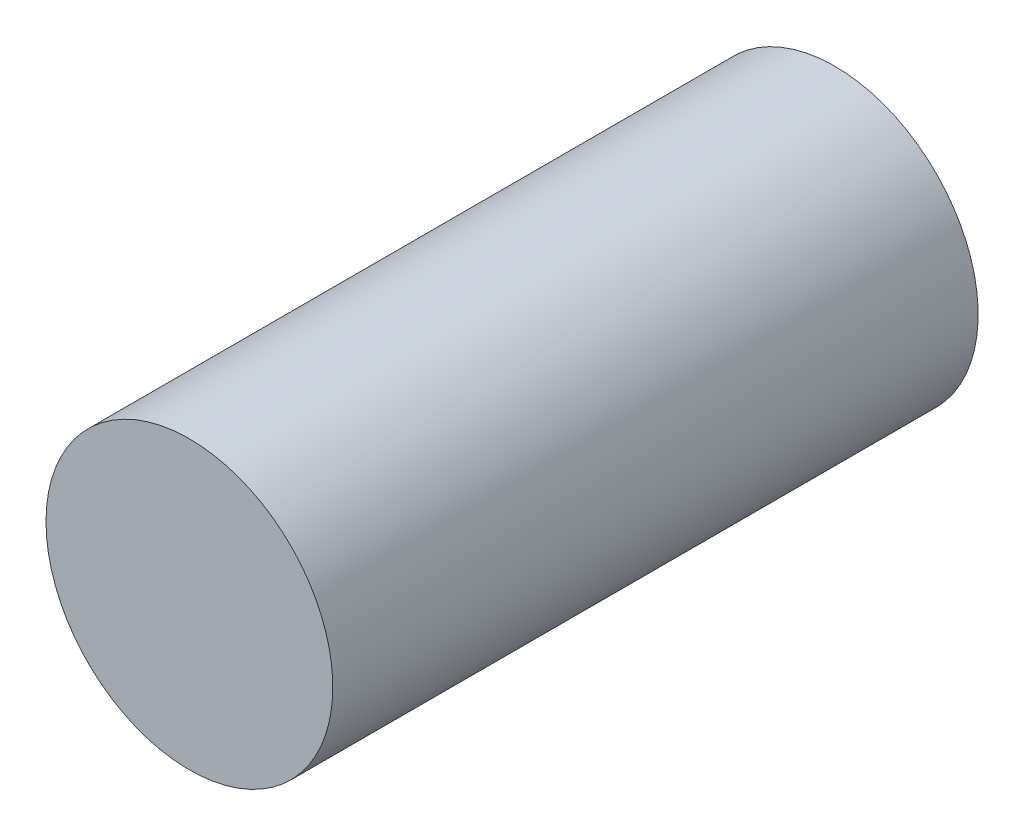
ISO-10303-21;
HEADER;
FILE_DESCRIPTION(('STEP AP214'),'2;1');
FILE_NAME('part.step','',(''),(''),'','','');
FILE_SCHEMA(('AUTOMOTIVE_DESIGN { 1 0 10303 214 1 1 1 1 }'));
ENDSEC;
DATA;
#1=APPLICATION_CONTEXT('core data for automotive mechanical design processes');
#2=APPLICATION_PROTOCOL_DEFINITION('international standard','automotive_design',2000,#1);
#3=PRODUCT_CONTEXT('',#1,'mechanical');
#4=PRODUCT('Part','Part','',(#3));
#5=PRODUCT_RELATED_PRODUCT_CATEGORY('part','',(#4));
#6=PRODUCT_DEFINITION_FORMATION('','',#4);
#7=PRODUCT_DEFINITION_CONTEXT('part definition',#1,'design');
#8=PRODUCT_DEFINITION('design','',#6,#7);
#9=PRODUCT_DEFINITION_SHAPE('','',#8);
#10=(LENGTH_UNIT() NAMED_UNIT(*) SI_UNIT(.MILLI.,.METRE.));
#11=(NAMED_UNIT(*) PLANE_ANGLE_UNIT() SI_UNIT($,.RADIAN.));
#12=(NAMED_UNIT(*) SI_UNIT($,.STERADIAN.) SOLID_ANGLE_UNIT());
#13=UNCERTAINTY_MEASURE_WITH_UNIT(LENGTH_MEASURE(1.E-05),#10,'distance_accuracy_value','');
#14=(GEOMETRIC_REPRESENTATION_CONTEXT(3) GLOBAL_UNCERTAINTY_ASSIGNED_CONTEXT((#13)) GLOBAL_UNIT_ASSIGNED_CONTEXT((#10,
#11,#12)) REPRESENTATION_CONTEXT('',''));
#15=CARTESIAN_POINT('',(0.,0.,0.));
#16=DIRECTION('',(0.,0.,1.));
#17=DIRECTION('',(1.,0.,0.));
#18=AXIS2_PLACEMENT_3D('',#15,#16,#17);
#19=CARTESIAN_POINT('',(0.,0.,22.5));
#20=DIRECTION('',(0.,0.,-1.));
#21=DIRECTION('',(-1.,0.,0.));
#22=AXIS2_PLACEMENT_3D('',#19,#20,#21);
#23=CYLINDRICAL_SURFACE('',#22,5.);
#24=CARTESIAN_POINT('',(0.,0.,22.5));
#25=DIRECTION('',(0.,0.,1.));
#26=DIRECTION('',(1.,0.,0.));
#27=AXIS2_PLACEMENT_3D('',#24,#25,#26);
#28=CIRCLE('',#27,5.);
#29=CARTESIAN_POINT('',(-5.,0.,22.5));
#30=VERTEX_POINT('',#29);
#31=EDGE_CURVE('E10',#30,#30,#28,.T.);
#32=CARTESIAN_POINT('',(0.,0.,0.));
#33=DIRECTION('',(0.,0.,1.));
#34=DIRECTION('',(1.,0.,0.));
#35=AXIS2_PLACEMENT_3D('',#32,#33,#34);
#36=CIRCLE('',#35,5.);
#37=CARTESIAN_POINT('',(-5.,0.,0.));
#38=VERTEX_POINT('',#37);
#39=EDGE_CURVE('E40',#38,#38,#36,.T.);
#40=CARTESIAN_POINT('',(-5.,0.,22.5));
#41=CARTESIAN_POINT('',(-5.,0.,22.265625));
#42=CARTESIAN_POINT('',(-5.,0.,22.03125));
#43=CARTESIAN_POINT('',(-5.,0.,21.5625));
#44=CARTESIAN_POINT('',(-5.,0.,21.328125));
#45=CARTESIAN_POINT('',(-5.,0.,20.859375));
#46=CARTESIAN_POINT('',(-5.,0.,20.625));
#47=CARTESIAN_POINT('',(-5.,0.,20.15625));
#48=CARTESIAN_POINT('',(-5.,0.,19.921875));
#49=CARTESIAN_POINT('',(-5.,0.,19.453125));
#50=CARTESIAN_POINT('',(-5.,0.,19.21875));
#51=CARTESIAN_POINT('',(-5.,0.,18.75));
#52=CARTESIAN_POINT('',(-5.,0.,18.515625));
#53=CARTESIAN_POINT('',(-5.,0.,18.046875));
#54=CARTESIAN_POINT('',(-5.,0.,17.8125));
#55=CARTESIAN_POINT('',(-5.,0.,17.34375));
#56=CARTESIAN_POINT('',(-5.,0.,17.109375));
#57=CARTESIAN_POINT('',(-5.,0.,16.640625));
#58=CARTESIAN_POINT('',(-5.,0.,16.40625));
#59=CARTESIAN_POINT('',(-5.,0.,15.9375));
#60=CARTESIAN_POINT('',(-5.,0.,15.703125));
#61=CARTESIAN_POINT('',(-5.,0.,15.234375));
#62=CARTESIAN_POINT('',(-5.,0.,15.));
#63=CARTESIAN_POINT('',(-5.,0.,14.53125));
#64=CARTESIAN_POINT('',(-5.,0.,14.296875));
#65=CARTESIAN_POINT('',(-5.,0.,13.828125));
#66=CARTESIAN_POINT('',(-5.,0.,13.59375));
#67=CARTESIAN_POINT('',(-5.,0.,13.125));
#68=CARTESIAN_POINT('',(-5.,0.,12.890625));
#69=CARTESIAN_POINT('',(-5.,0.,12.421875));
#70=CARTESIAN_POINT('',(-5.,0.,12.1875));
#71=CARTESIAN_POINT('',(-5.,0.,11.71875));
#72=CARTESIAN_POINT('',(-5.,0.,11.484375));
#73=CARTESIAN_POINT('',(-5.,0.,11.015625));
#74=CARTESIAN_POINT('',(-5.,0.,10.78125));
#75=CARTESIAN_POINT('',(-5.,0.,10.3125));
#76=CARTESIAN_POINT('',(-5.,0.,10.078125));
#77=CARTESIAN_POINT('',(-5.,0.,9.60937499999999));
#78=CARTESIAN_POINT('',(-5.,0.,9.375));
#79=CARTESIAN_POINT('',(-5.,0.,8.90625));
#80=CARTESIAN_POINT('',(-5.,0.,8.671875));
#81=CARTESIAN_POINT('',(-5.,0.,8.20312499999999));
#82=CARTESIAN_POINT('',(-5.,0.,7.96874999999999));
#83=CARTESIAN_POINT('',(-5.,0.,7.5));
#84=CARTESIAN_POINT('',(-5.,0.,7.265625));
#85=CARTESIAN_POINT('',(-5.,0.,6.796875));
#86=CARTESIAN_POINT('',(-5.,0.,6.5625));
#87=CARTESIAN_POINT('',(-5.,0.,6.09375));
#88=CARTESIAN_POINT('',(-5.,0.,5.859375));
#89=CARTESIAN_POINT('',(-5.,0.,5.390625));
#90=CARTESIAN_POINT('',(-5.,0.,5.15625));
#91=CARTESIAN_POINT('',(-5.,0.,4.6875));
#92=CARTESIAN_POINT('',(-5.,0.,4.453125));
#93=CARTESIAN_POINT('',(-5.,0.,3.984375));
#94=CARTESIAN_POINT('',(-5.,0.,3.75));
#95=CARTESIAN_POINT('',(-5.,0.,3.28125));
#96=CARTESIAN_POINT('',(-5.,0.,3.046875));
#97=CARTESIAN_POINT('',(-5.,0.,2.578125));
#98=CARTESIAN_POINT('',(-5.,0.,2.34375));
#99=CARTESIAN_POINT('',(-5.,0.,1.875));
#100=CARTESIAN_POINT('',(-5.,0.,1.640625));
#101=CARTESIAN_POINT('',(-5.,0.,1.171875));
#102=CARTESIAN_POINT('',(-5.,0.,0.937499999999996));
#103=CARTESIAN_POINT('',(-5.,0.,0.468749999999996));
#104=CARTESIAN_POINT('',(-5.,0.,0.234374999999996));
#105=CARTESIAN_POINT('',(-5.,0.,0.));
#106=B_SPLINE_CURVE_WITH_KNOTS('',3,(#40,#41,#42,#43,#44,#45,#46,#47,#48,#49,#50,#51,#52,#53,
#54,#55,#56,#57,#58,#59,#60,#61,#62,#63,#64,#65,#66,#67,#68,#69,#70,#71,#72,#73,#74,#75,#76,#77,
#78,#79,#80,#81,#82,#83,#84,#85,#86,#87,#88,#89,#90,#91,#92,#93,#94,#95,#96,#97,#98,#99,#100,
#101,#102,#103,#104,#105),.UNSPECIFIED.,.F.,.F.,(4,2,2,2,2,2,2,2,2,2,2,2,2,2,2,2,2,2,2,2,2,2,2,
2,2,2,2,2,2,2,2,2,4),(0.,0.703125000000002,1.40625,2.109375,2.8125,3.515625,4.21875,4.921875,
5.625,6.328125,7.03125,7.734375,8.4375,9.140625,9.84375,10.546875,11.25,11.953125,12.65625,
13.359375,14.0625,14.765625,15.46875,16.171875,16.875,17.578125,18.28125,18.984375,19.6875,
20.390625,21.09375,21.796875,22.5),.UNSPECIFIED.);
#107=EDGE_CURVE('BSEAM37',#30,#38,#106,.T.);
#108=ORIENTED_EDGE('',*,*,#31,.F.);
#109=ORIENTED_EDGE('',*,*,#39,.T.);
#110=ORIENTED_EDGE('',*,*,#107,.T.);
#111=ORIENTED_EDGE('',*,*,#107,.F.);
#112=EDGE_LOOP('',(#108,#110,#109,#111));
#113=FACE_BOUND('',#112,.T.);
#114=ADVANCED_FACE('F37',(#113),#23,.T.);
#115=CARTESIAN_POINT('',(0.,0.,22.5));
#116=DIRECTION('',(0.,0.,1.));
#117=DIRECTION('',(1.,0.,0.));
#118=AXIS2_PLACEMENT_3D('',#115,#116,#117);
#119=PLANE('',#118);
#120=ORIENTED_EDGE('',*,*,#31,.T.);
#121=EDGE_LOOP('',(#120));
#122=FACE_BOUND('',#121,.T.);
#123=ADVANCED_FACE('F52',(#122),#119,.T.);
#124=CARTESIAN_POINT('',(0.,0.,0.));
#125=DIRECTION('',(0.,0.,1.));
#126=DIRECTION('',(1.,0.,0.));
#127=AXIS2_PLACEMENT_3D('',#124,#125,#126);
#128=PLANE('',#127);
#129=ORIENTED_EDGE('',*,*,#39,.F.);
#130=EDGE_LOOP('',(#129));
#131=FACE_BOUND('',#130,.T.);
#132=ADVANCED_FACE('F50',(#131),#128,.F.);
#133=CLOSED_SHELL('',(#114,#123,#132));
#134=MANIFOLD_SOLID_BREP('B2',#133);
#135=ADVANCED_BREP_SHAPE_REPRESENTATION('',(#18,#134),#14);
#136=SHAPE_DEFINITION_REPRESENTATION(#9,#135);
ENDSEC;
END-ISO-10303-21;
